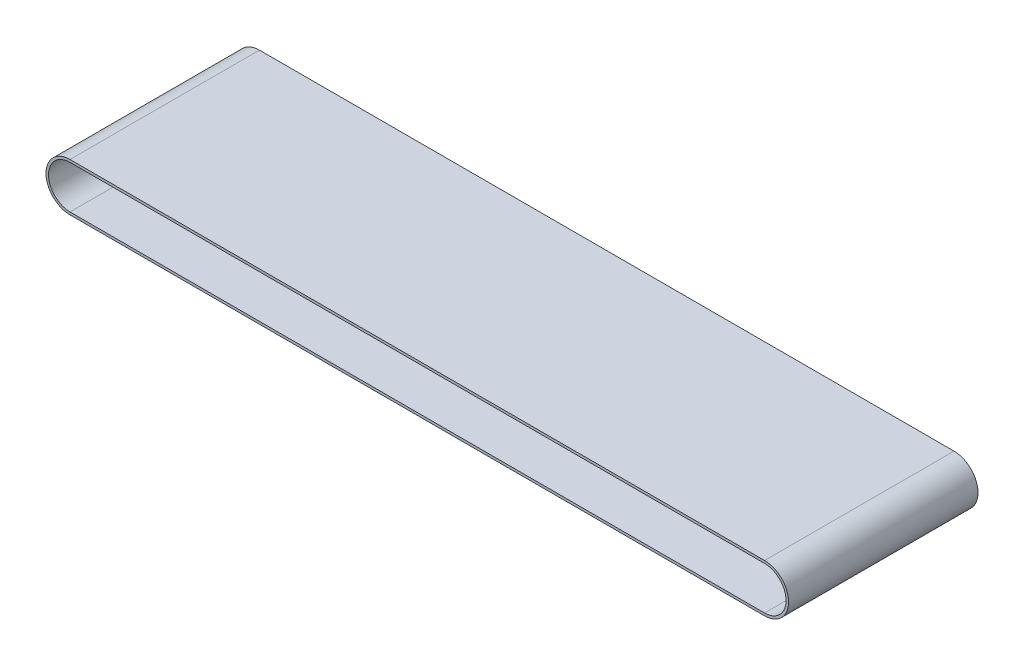
ISO-10303-21;
HEADER;
FILE_DESCRIPTION(('STEP AP214'),'2;1');
FILE_NAME('part.step','',(''),(''),'','','');
FILE_SCHEMA(('AUTOMOTIVE_DESIGN { 1 0 10303 214 1 1 1 1 }'));
ENDSEC;
DATA;
#1=APPLICATION_CONTEXT('core data for automotive mechanical design processes');
#2=APPLICATION_PROTOCOL_DEFINITION('international standard','automotive_design',2000,#1);
#3=PRODUCT_CONTEXT('',#1,'mechanical');
#4=PRODUCT('Part','Part','',(#3));
#5=PRODUCT_RELATED_PRODUCT_CATEGORY('part','',(#4));
#6=PRODUCT_DEFINITION_FORMATION('','',#4);
#7=PRODUCT_DEFINITION_CONTEXT('part definition',#1,'design');
#8=PRODUCT_DEFINITION('design','',#6,#7);
#9=PRODUCT_DEFINITION_SHAPE('','',#8);
#10=(LENGTH_UNIT() NAMED_UNIT(*) SI_UNIT(.MILLI.,.METRE.));
#11=(NAMED_UNIT(*) PLANE_ANGLE_UNIT() SI_UNIT($,.RADIAN.));
#12=(NAMED_UNIT(*) SI_UNIT($,.STERADIAN.) SOLID_ANGLE_UNIT());
#13=UNCERTAINTY_MEASURE_WITH_UNIT(LENGTH_MEASURE(1.E-05),#10,'distance_accuracy_value','');
#14=(GEOMETRIC_REPRESENTATION_CONTEXT(3) GLOBAL_UNCERTAINTY_ASSIGNED_CONTEXT((#13)) GLOBAL_UNIT_ASSIGNED_CONTEXT((#10,
#11,#12)) REPRESENTATION_CONTEXT('',''));
#15=CARTESIAN_POINT('',(0.,0.,0.));
#16=DIRECTION('',(0.,0.,1.));
#17=DIRECTION('',(1.,0.,0.));
#18=AXIS2_PLACEMENT_3D('',#15,#16,#17);
#19=CARTESIAN_POINT('',(0.,0.,0.));
#20=DIRECTION('',(0.,0.,1.));
#21=DIRECTION('',(1.,0.,0.));
#22=AXIS2_PLACEMENT_3D('',#19,#20,#21);
#23=PLANE('',#22);
#24=DIRECTION('',(-1.,0.,0.));
#25=VECTOR('',#24,1.);
#26=CARTESIAN_POINT('',(0.,17.,0.));
#27=LINE('',#26,#25);
#28=CARTESIAN_POINT('',(550.,17.,0.));
#29=VERTEX_POINT('',#28);
#30=CARTESIAN_POINT('',(0.,17.,0.));
#31=VERTEX_POINT('',#30);
#32=EDGE_CURVE('E41',#29,#31,#27,.T.);
#33=ORIENTED_EDGE('',*,*,#32,.T.);
#34=CARTESIAN_POINT('',(0.,0.,0.));
#35=DIRECTION('',(0.,0.,1.));
#36=DIRECTION('',(1.,0.,0.));
#37=AXIS2_PLACEMENT_3D('',#34,#35,#36);
#38=CIRCLE('',#37,17.);
#39=CARTESIAN_POINT('',(0.,-17.,0.));
#40=VERTEX_POINT('',#39);
#41=EDGE_CURVE('E11',#31,#40,#38,.T.);
#42=ORIENTED_EDGE('',*,*,#41,.T.);
#43=DIRECTION('',(1.,0.,0.));
#44=VECTOR('',#43,1.);
#45=CARTESIAN_POINT('',(0.,-17.,0.));
#46=LINE('',#45,#44);
#47=CARTESIAN_POINT('',(550.,-17.,0.));
#48=VERTEX_POINT('',#47);
#49=EDGE_CURVE('E147',#40,#48,#46,.T.);
#50=ORIENTED_EDGE('',*,*,#49,.T.);
#51=CARTESIAN_POINT('',(550.,0.,0.));
#52=DIRECTION('',(0.,0.,1.));
#53=DIRECTION('',(1.,0.,0.));
#54=AXIS2_PLACEMENT_3D('',#51,#52,#53);
#55=CIRCLE('',#54,17.);
#56=EDGE_CURVE('E156',#48,#29,#55,.T.);
#57=ORIENTED_EDGE('',*,*,#56,.T.);
#58=EDGE_LOOP('',(#33,#42,#50,#57));
#59=FACE_BOUND('',#58,.T.);
#60=CARTESIAN_POINT('',(0.,0.,0.));
#61=DIRECTION('',(0.,0.,1.));
#62=DIRECTION('',(1.,0.,0.));
#63=AXIS2_PLACEMENT_3D('',#60,#61,#62);
#64=CIRCLE('',#63,19.);
#65=CARTESIAN_POINT('',(0.,19.,0.));
#66=VERTEX_POINT('',#65);
#67=CARTESIAN_POINT('',(0.,-19.,0.));
#68=VERTEX_POINT('',#67);
#69=EDGE_CURVE('E131',#66,#68,#64,.T.);
#70=ORIENTED_EDGE('',*,*,#69,.F.);
#71=DIRECTION('',(-1.,0.,0.));
#72=VECTOR('',#71,1.);
#73=CARTESIAN_POINT('',(0.,19.,0.));
#74=LINE('',#73,#72);
#75=CARTESIAN_POINT('',(550.,19.,0.));
#76=VERTEX_POINT('',#75);
#77=EDGE_CURVE('E129',#76,#66,#74,.T.);
#78=ORIENTED_EDGE('',*,*,#77,.F.);
#79=CARTESIAN_POINT('',(550.,0.,0.));
#80=DIRECTION('',(0.,0.,1.));
#81=DIRECTION('',(1.,0.,0.));
#82=AXIS2_PLACEMENT_3D('',#79,#80,#81);
#83=CIRCLE('',#82,19.);
#84=CARTESIAN_POINT('',(550.,-19.,0.));
#85=VERTEX_POINT('',#84);
#86=EDGE_CURVE('E101',#85,#76,#83,.T.);
#87=ORIENTED_EDGE('',*,*,#86,.F.);
#88=DIRECTION('',(1.,0.,0.));
#89=VECTOR('',#88,1.);
#90=CARTESIAN_POINT('',(0.,-19.,0.));
#91=LINE('',#90,#89);
#92=EDGE_CURVE('E123',#68,#85,#91,.T.);
#93=ORIENTED_EDGE('',*,*,#92,.F.);
#94=EDGE_LOOP('',(#70,#78,#87,#93));
#95=FACE_BOUND('',#94,.T.);
#96=ADVANCED_FACE('F34',(#59,#95),#23,.F.);
#97=CARTESIAN_POINT('',(0.,0.,150.));
#98=DIRECTION('',(0.,0.,1.));
#99=DIRECTION('',(1.,0.,0.));
#100=AXIS2_PLACEMENT_3D('',#97,#98,#99);
#101=PLANE('',#100);
#102=CARTESIAN_POINT('',(0.,0.,150.));
#103=DIRECTION('',(0.,0.,1.));
#104=DIRECTION('',(1.,0.,0.));
#105=AXIS2_PLACEMENT_3D('',#102,#103,#104);
#106=CIRCLE('',#105,17.);
#107=CARTESIAN_POINT('',(0.,17.,150.));
#108=VERTEX_POINT('',#107);
#109=CARTESIAN_POINT('',(0.,-17.,150.));
#110=VERTEX_POINT('',#109);
#111=EDGE_CURVE('E133',#108,#110,#106,.T.);
#112=ORIENTED_EDGE('',*,*,#111,.F.);
#113=DIRECTION('',(-1.,0.,0.));
#114=VECTOR('',#113,1.);
#115=CARTESIAN_POINT('',(550.,17.,150.));
#116=LINE('',#115,#114);
#117=CARTESIAN_POINT('',(550.,17.,150.));
#118=VERTEX_POINT('',#117);
#119=EDGE_CURVE('E141',#118,#108,#116,.T.);
#120=ORIENTED_EDGE('',*,*,#119,.F.);
#121=CARTESIAN_POINT('',(550.,0.,150.));
#122=DIRECTION('',(0.,0.,1.));
#123=DIRECTION('',(1.,0.,0.));
#124=AXIS2_PLACEMENT_3D('',#121,#122,#123);
#125=CIRCLE('',#124,17.);
#126=CARTESIAN_POINT('',(550.,-17.,150.));
#127=VERTEX_POINT('',#126);
#128=EDGE_CURVE('E138',#127,#118,#125,.T.);
#129=ORIENTED_EDGE('',*,*,#128,.F.);
#130=DIRECTION('',(1.,0.,0.));
#131=VECTOR('',#130,1.);
#132=CARTESIAN_POINT('',(0.,-17.,150.));
#133=LINE('',#132,#131);
#134=EDGE_CURVE('E135',#110,#127,#133,.T.);
#135=ORIENTED_EDGE('',*,*,#134,.F.);
#136=EDGE_LOOP('',(#112,#120,#129,#135));
#137=FACE_BOUND('',#136,.T.);
#138=DIRECTION('',(-1.,0.,0.));
#139=VECTOR('',#138,1.);
#140=CARTESIAN_POINT('',(0.,19.,150.));
#141=LINE('',#140,#139);
#142=CARTESIAN_POINT('',(550.,19.,150.));
#143=VERTEX_POINT('',#142);
#144=CARTESIAN_POINT('',(0.,19.,150.));
#145=VERTEX_POINT('',#144);
#146=EDGE_CURVE('E108',#143,#145,#141,.T.);
#147=ORIENTED_EDGE('',*,*,#146,.T.);
#148=CARTESIAN_POINT('',(0.,0.,150.));
#149=DIRECTION('',(0.,0.,1.));
#150=DIRECTION('',(1.,0.,0.));
#151=AXIS2_PLACEMENT_3D('',#148,#149,#150);
#152=CIRCLE('',#151,19.);
#153=CARTESIAN_POINT('',(0.,-19.,150.));
#154=VERTEX_POINT('',#153);
#155=EDGE_CURVE('E119',#145,#154,#152,.T.);
#156=ORIENTED_EDGE('',*,*,#155,.T.);
#157=DIRECTION('',(1.,0.,0.));
#158=VECTOR('',#157,1.);
#159=CARTESIAN_POINT('',(0.,-19.,150.));
#160=LINE('',#159,#158);
#161=CARTESIAN_POINT('',(550.,-19.,150.));
#162=VERTEX_POINT('',#161);
#163=EDGE_CURVE('E117',#154,#162,#160,.T.);
#164=ORIENTED_EDGE('',*,*,#163,.T.);
#165=CARTESIAN_POINT('',(550.,0.,150.));
#166=DIRECTION('',(0.,0.,1.));
#167=DIRECTION('',(1.,0.,0.));
#168=AXIS2_PLACEMENT_3D('',#165,#166,#167);
#169=CIRCLE('',#168,19.);
#170=EDGE_CURVE('E56',#162,#143,#169,.T.);
#171=ORIENTED_EDGE('',*,*,#170,.T.);
#172=EDGE_LOOP('',(#147,#156,#164,#171));
#173=FACE_BOUND('',#172,.T.);
#174=ADVANCED_FACE('F116',(#137,#173),#101,.T.);
#175=CARTESIAN_POINT('',(0.,0.,-75.));
#176=DIRECTION('',(0.,0.,1.));
#177=DIRECTION('',(1.,0.,0.));
#178=AXIS2_PLACEMENT_3D('',#175,#176,#177);
#179=CYLINDRICAL_SURFACE('',#178,17.);
#180=DIRECTION('',(0.,0.,1.));
#181=VECTOR('',#180,1.);
#182=CARTESIAN_POINT('',(0.,17.,-75.));
#183=LINE('',#182,#181);
#184=EDGE_CURVE('E145',#31,#108,#183,.T.);
#185=ORIENTED_EDGE('',*,*,#184,.T.);
#186=ORIENTED_EDGE('',*,*,#111,.T.);
#187=DIRECTION('',(0.,0.,1.));
#188=VECTOR('',#187,1.);
#189=CARTESIAN_POINT('',(0.,-17.,-75.));
#190=LINE('',#189,#188);
#191=EDGE_CURVE('E144',#40,#110,#190,.T.);
#192=ORIENTED_EDGE('',*,*,#191,.F.);
#193=ORIENTED_EDGE('',*,*,#41,.F.);
#194=EDGE_LOOP('',(#185,#186,#192,#193));
#195=FACE_BOUND('',#194,.T.);
#196=ADVANCED_FACE('F175',(#195),#179,.F.);
#197=CARTESIAN_POINT('',(550.,17.,-75.));
#198=DIRECTION('',(0.,1.,0.));
#199=DIRECTION('',(-1.,0.,0.));
#200=AXIS2_PLACEMENT_3D('',#197,#198,#199);
#201=PLANE('',#200);
#202=DIRECTION('',(0.,0.,1.));
#203=VECTOR('',#202,1.);
#204=CARTESIAN_POINT('',(550.,17.,-75.));
#205=LINE('',#204,#203);
#206=EDGE_CURVE('E148',#29,#118,#205,.T.);
#207=ORIENTED_EDGE('',*,*,#206,.T.);
#208=ORIENTED_EDGE('',*,*,#119,.T.);
#209=ORIENTED_EDGE('',*,*,#184,.F.);
#210=ORIENTED_EDGE('',*,*,#32,.F.);
#211=EDGE_LOOP('',(#207,#208,#209,#210));
#212=FACE_BOUND('',#211,.T.);
#213=ADVANCED_FACE('F165',(#212),#201,.F.);
#214=CARTESIAN_POINT('',(550.,0.,-75.));
#215=DIRECTION('',(0.,0.,1.));
#216=DIRECTION('',(1.,0.,0.));
#217=AXIS2_PLACEMENT_3D('',#214,#215,#216);
#218=CYLINDRICAL_SURFACE('',#217,17.);
#219=DIRECTION('',(0.,0.,1.));
#220=VECTOR('',#219,1.);
#221=CARTESIAN_POINT('',(550.,-17.,-75.));
#222=LINE('',#221,#220);
#223=EDGE_CURVE('E150',#48,#127,#222,.T.);
#224=ORIENTED_EDGE('',*,*,#223,.T.);
#225=ORIENTED_EDGE('',*,*,#128,.T.);
#226=ORIENTED_EDGE('',*,*,#206,.F.);
#227=ORIENTED_EDGE('',*,*,#56,.F.);
#228=EDGE_LOOP('',(#224,#225,#226,#227));
#229=FACE_BOUND('',#228,.T.);
#230=ADVANCED_FACE('F167',(#229),#218,.F.);
#231=CARTESIAN_POINT('',(0.,-17.,-75.));
#232=DIRECTION('',(0.,-1.,0.));
#233=DIRECTION('',(1.,0.,0.));
#234=AXIS2_PLACEMENT_3D('',#231,#232,#233);
#235=PLANE('',#234);
#236=ORIENTED_EDGE('',*,*,#191,.T.);
#237=ORIENTED_EDGE('',*,*,#134,.T.);
#238=ORIENTED_EDGE('',*,*,#223,.F.);
#239=ORIENTED_EDGE('',*,*,#49,.F.);
#240=EDGE_LOOP('',(#236,#237,#238,#239));
#241=FACE_BOUND('',#240,.T.);
#242=ADVANCED_FACE('F177',(#241),#235,.F.);
#243=CARTESIAN_POINT('',(0.,0.,-75.));
#244=DIRECTION('',(0.,0.,1.));
#245=DIRECTION('',(1.,0.,0.));
#246=AXIS2_PLACEMENT_3D('',#243,#244,#245);
#247=CYLINDRICAL_SURFACE('',#246,19.);
#248=ORIENTED_EDGE('',*,*,#69,.T.);
#249=DIRECTION('',(0.,0.,1.));
#250=VECTOR('',#249,1.);
#251=CARTESIAN_POINT('',(0.,-19.,-75.));
#252=LINE('',#251,#250);
#253=EDGE_CURVE('E48',#68,#154,#252,.T.);
#254=ORIENTED_EDGE('',*,*,#253,.T.);
#255=ORIENTED_EDGE('',*,*,#155,.F.);
#256=DIRECTION('',(0.,0.,1.));
#257=VECTOR('',#256,1.);
#258=CARTESIAN_POINT('',(0.,19.,-75.));
#259=LINE('',#258,#257);
#260=EDGE_CURVE('E104',#66,#145,#259,.T.);
#261=ORIENTED_EDGE('',*,*,#260,.F.);
#262=EDGE_LOOP('',(#248,#254,#255,#261));
#263=FACE_BOUND('',#262,.T.);
#264=ADVANCED_FACE('F179',(#263),#247,.T.);
#265=CARTESIAN_POINT('',(0.,19.,-75.));
#266=DIRECTION('',(0.,1.,0.));
#267=DIRECTION('',(0.,0.,1.));
#268=AXIS2_PLACEMENT_3D('',#265,#266,#267);
#269=PLANE('',#268);
#270=ORIENTED_EDGE('',*,*,#77,.T.);
#271=ORIENTED_EDGE('',*,*,#260,.T.);
#272=ORIENTED_EDGE('',*,*,#146,.F.);
#273=DIRECTION('',(0.,0.,1.));
#274=VECTOR('',#273,1.);
#275=CARTESIAN_POINT('',(550.,19.,-75.));
#276=LINE('',#275,#274);
#277=EDGE_CURVE('E97',#76,#143,#276,.T.);
#278=ORIENTED_EDGE('',*,*,#277,.F.);
#279=EDGE_LOOP('',(#270,#271,#272,#278));
#280=FACE_BOUND('',#279,.T.);
#281=ADVANCED_FACE('F109',(#280),#269,.T.);
#282=CARTESIAN_POINT('',(550.,0.,-75.));
#283=DIRECTION('',(0.,0.,1.));
#284=DIRECTION('',(1.,0.,0.));
#285=AXIS2_PLACEMENT_3D('',#282,#283,#284);
#286=CYLINDRICAL_SURFACE('',#285,19.);
#287=ORIENTED_EDGE('',*,*,#86,.T.);
#288=ORIENTED_EDGE('',*,*,#277,.T.);
#289=ORIENTED_EDGE('',*,*,#170,.F.);
#290=DIRECTION('',(0.,0.,1.));
#291=VECTOR('',#290,1.);
#292=CARTESIAN_POINT('',(550.,-19.,-75.));
#293=LINE('',#292,#291);
#294=EDGE_CURVE('E105',#85,#162,#293,.T.);
#295=ORIENTED_EDGE('',*,*,#294,.F.);
#296=EDGE_LOOP('',(#287,#288,#289,#295));
#297=FACE_BOUND('',#296,.T.);
#298=ADVANCED_FACE('F99',(#297),#286,.T.);
#299=CARTESIAN_POINT('',(0.,-19.,-75.));
#300=DIRECTION('',(0.,-1.,0.));
#301=DIRECTION('',(0.,0.,-1.));
#302=AXIS2_PLACEMENT_3D('',#299,#300,#301);
#303=PLANE('',#302);
#304=ORIENTED_EDGE('',*,*,#92,.T.);
#305=ORIENTED_EDGE('',*,*,#294,.T.);
#306=ORIENTED_EDGE('',*,*,#163,.F.);
#307=ORIENTED_EDGE('',*,*,#253,.F.);
#308=EDGE_LOOP('',(#304,#305,#306,#307));
#309=FACE_BOUND('',#308,.T.);
#310=ADVANCED_FACE('F203',(#309),#303,.T.);
#311=CLOSED_SHELL('',(#96,#174,#196,#213,#230,#242,#264,#281,#298,#310));
#312=MANIFOLD_SOLID_BREP('B2',#311);
#313=ADVANCED_BREP_SHAPE_REPRESENTATION('',(#18,#312),#14);
#314=SHAPE_DEFINITION_REPRESENTATION(#9,#313);
ENDSEC;
END-ISO-10303-21;
